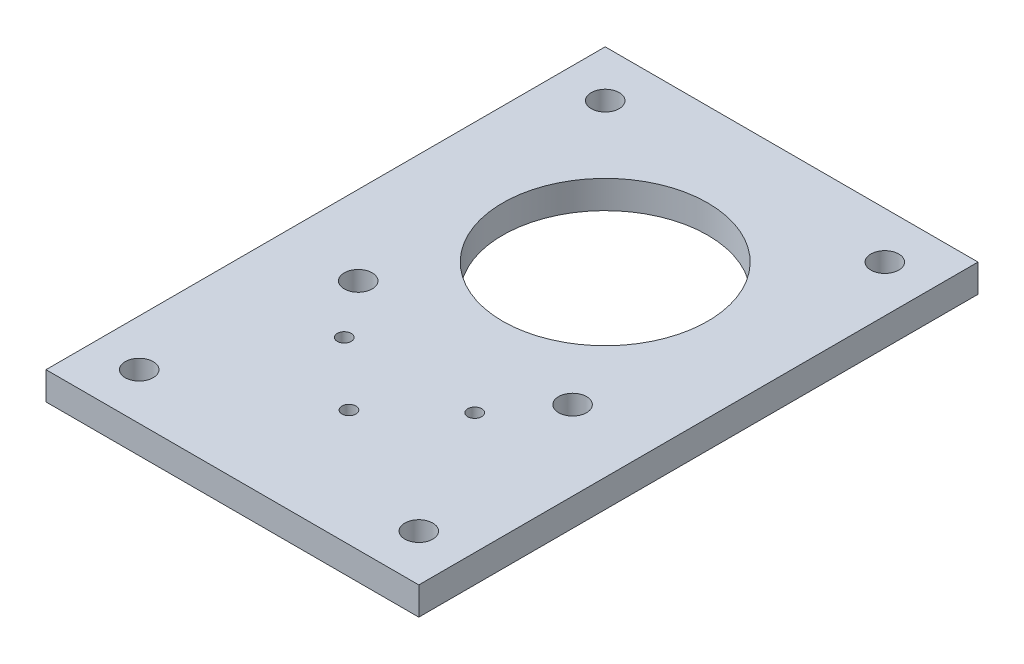
ISO-10303-21;
HEADER;
FILE_DESCRIPTION(('STEP AP214'),'2;1');
FILE_NAME('part.step','',(''),(''),'','','');
FILE_SCHEMA(('AUTOMOTIVE_DESIGN { 1 0 10303 214 1 1 1 1 }'));
ENDSEC;
DATA;
#1=APPLICATION_CONTEXT('core data for automotive mechanical design processes');
#2=APPLICATION_PROTOCOL_DEFINITION('international standard','automotive_design',2000,#1);
#3=PRODUCT_CONTEXT('',#1,'mechanical');
#4=PRODUCT('Part','Part','',(#3));
#5=PRODUCT_RELATED_PRODUCT_CATEGORY('part','',(#4));
#6=PRODUCT_DEFINITION_FORMATION('','',#4);
#7=PRODUCT_DEFINITION_CONTEXT('part definition',#1,'design');
#8=PRODUCT_DEFINITION('design','',#6,#7);
#9=PRODUCT_DEFINITION_SHAPE('','',#8);
#10=(LENGTH_UNIT() NAMED_UNIT(*) SI_UNIT(.MILLI.,.METRE.));
#11=(NAMED_UNIT(*) PLANE_ANGLE_UNIT() SI_UNIT($,.RADIAN.));
#12=(NAMED_UNIT(*) SI_UNIT($,.STERADIAN.) SOLID_ANGLE_UNIT());
#13=UNCERTAINTY_MEASURE_WITH_UNIT(LENGTH_MEASURE(1.E-05),#10,'distance_accuracy_value','');
#14=(GEOMETRIC_REPRESENTATION_CONTEXT(3) GLOBAL_UNCERTAINTY_ASSIGNED_CONTEXT((#13)) GLOBAL_UNIT_ASSIGNED_CONTEXT((#10,
#11,#12)) REPRESENTATION_CONTEXT('',''));
#15=CARTESIAN_POINT('',(0.,0.,0.));
#16=DIRECTION('',(0.,0.,1.));
#17=DIRECTION('',(1.,0.,0.));
#18=AXIS2_PLACEMENT_3D('',#15,#16,#17);
#19=CARTESIAN_POINT('',(0.,3.,0.));
#20=DIRECTION('',(0.,1.,0.));
#21=DIRECTION('',(0.,0.,1.));
#22=AXIS2_PLACEMENT_3D('',#19,#20,#21);
#23=PLANE('',#22);
#24=CARTESIAN_POINT('',(-11.5,3.,15.));
#25=DIRECTION('',(0.,1.,0.));
#26=DIRECTION('',(0.,0.,1.));
#27=AXIS2_PLACEMENT_3D('',#24,#25,#26);
#28=CIRCLE('',#27,1.5);
#29=CARTESIAN_POINT('',(-11.5,3.,16.5));
#30=VERTEX_POINT('',#29);
#31=EDGE_CURVE('E158',#30,#30,#28,.T.);
#32=ORIENTED_EDGE('',*,*,#31,.F.);
#33=EDGE_LOOP('',(#32));
#34=FACE_BOUND('',#33,.T.);
#35=CARTESIAN_POINT('',(-7.,3.,21.));
#36=DIRECTION('',(0.,1.,0.));
#37=DIRECTION('',(0.,0.,1.));
#38=AXIS2_PLACEMENT_3D('',#35,#36,#37);
#39=CIRCLE('',#38,0.750000000000001);
#40=CARTESIAN_POINT('',(-7.,3.,21.75));
#41=VERTEX_POINT('',#40);
#42=EDGE_CURVE('E146',#41,#41,#39,.T.);
#43=ORIENTED_EDGE('',*,*,#42,.F.);
#44=EDGE_LOOP('',(#43));
#45=FACE_BOUND('',#44,.T.);
#46=CARTESIAN_POINT('',(-15.,3.,35.));
#47=DIRECTION('',(0.,1.,0.));
#48=DIRECTION('',(0.,0.,1.));
#49=AXIS2_PLACEMENT_3D('',#46,#47,#48);
#50=CIRCLE('',#49,1.5);
#51=CARTESIAN_POINT('',(-15.,3.,36.5));
#52=VERTEX_POINT('',#51);
#53=EDGE_CURVE('E134',#52,#52,#50,.T.);
#54=ORIENTED_EDGE('',*,*,#53,.F.);
#55=EDGE_LOOP('',(#54));
#56=FACE_BOUND('',#55,.T.);
#57=CARTESIAN_POINT('',(15.,3.,-15.));
#58=DIRECTION('',(0.,1.,0.));
#59=DIRECTION('',(0.,0.,1.));
#60=AXIS2_PLACEMENT_3D('',#57,#58,#59);
#61=CIRCLE('',#60,1.5);
#62=CARTESIAN_POINT('',(15.,3.,-13.5));
#63=VERTEX_POINT('',#62);
#64=EDGE_CURVE('E122',#63,#63,#61,.T.);
#65=ORIENTED_EDGE('',*,*,#64,.F.);
#66=EDGE_LOOP('',(#65));
#67=FACE_BOUND('',#66,.T.);
#68=CARTESIAN_POINT('',(0.,3.,0.));
#69=DIRECTION('',(0.,1.,0.));
#70=DIRECTION('',(0.,0.,1.));
#71=AXIS2_PLACEMENT_3D('',#68,#69,#70);
#72=CIRCLE('',#71,11.);
#73=CARTESIAN_POINT('',(0.,3.,11.));
#74=VERTEX_POINT('',#73);
#75=EDGE_CURVE('E101',#74,#74,#72,.T.);
#76=ORIENTED_EDGE('',*,*,#75,.F.);
#77=EDGE_LOOP('',(#76));
#78=FACE_BOUND('',#77,.T.);
#79=DIRECTION('',(0.,0.,1.));
#80=VECTOR('',#79,1.);
#81=CARTESIAN_POINT('',(-20.,3.,-20.));
#82=LINE('',#81,#80);
#83=CARTESIAN_POINT('',(-20.,3.,-20.));
#84=VERTEX_POINT('',#83);
#85=CARTESIAN_POINT('',(-20.,3.,40.));
#86=VERTEX_POINT('',#85);
#87=EDGE_CURVE('E86',#84,#86,#82,.T.);
#88=ORIENTED_EDGE('',*,*,#87,.T.);
#89=DIRECTION('',(1.,0.,0.));
#90=VECTOR('',#89,1.);
#91=CARTESIAN_POINT('',(-20.,3.,40.));
#92=LINE('',#91,#90);
#93=CARTESIAN_POINT('',(20.,3.,40.));
#94=VERTEX_POINT('',#93);
#95=EDGE_CURVE('E81',#86,#94,#92,.T.);
#96=ORIENTED_EDGE('',*,*,#95,.T.);
#97=DIRECTION('',(0.,0.,-1.));
#98=VECTOR('',#97,1.);
#99=CARTESIAN_POINT('',(20.,3.,-20.));
#100=LINE('',#99,#98);
#101=CARTESIAN_POINT('',(20.,3.,-20.));
#102=VERTEX_POINT('',#101);
#103=EDGE_CURVE('E84',#94,#102,#100,.T.);
#104=ORIENTED_EDGE('',*,*,#103,.T.);
#105=DIRECTION('',(-1.,0.,0.));
#106=VECTOR('',#105,1.);
#107=CARTESIAN_POINT('',(-20.,3.,-20.));
#108=LINE('',#107,#106);
#109=EDGE_CURVE('E51',#102,#84,#108,.T.);
#110=ORIENTED_EDGE('',*,*,#109,.T.);
#111=EDGE_LOOP('',(#88,#96,#104,#110));
#112=FACE_BOUND('',#111,.T.);
#113=CARTESIAN_POINT('',(-15.,3.,-15.));
#114=DIRECTION('',(0.,1.,0.));
#115=DIRECTION('',(0.,0.,1.));
#116=AXIS2_PLACEMENT_3D('',#113,#114,#115);
#117=CIRCLE('',#116,1.5);
#118=CARTESIAN_POINT('',(-15.,3.,-13.5));
#119=VERTEX_POINT('',#118);
#120=EDGE_CURVE('E116',#119,#119,#117,.T.);
#121=ORIENTED_EDGE('',*,*,#120,.F.);
#122=EDGE_LOOP('',(#121));
#123=FACE_BOUND('',#122,.T.);
#124=CARTESIAN_POINT('',(15.,3.,35.));
#125=DIRECTION('',(0.,1.,0.));
#126=DIRECTION('',(0.,0.,1.));
#127=AXIS2_PLACEMENT_3D('',#124,#125,#126);
#128=CIRCLE('',#127,1.5);
#129=CARTESIAN_POINT('',(15.,3.,36.5));
#130=VERTEX_POINT('',#129);
#131=EDGE_CURVE('E128',#130,#130,#128,.T.);
#132=ORIENTED_EDGE('',*,*,#131,.F.);
#133=EDGE_LOOP('',(#132));
#134=FACE_BOUND('',#133,.T.);
#135=CARTESIAN_POINT('',(0.,3.,27.5));
#136=DIRECTION('',(0.,1.,0.));
#137=DIRECTION('',(0.,0.,1.));
#138=AXIS2_PLACEMENT_3D('',#135,#136,#137);
#139=CIRCLE('',#138,0.750000000000001);
#140=CARTESIAN_POINT('',(0.,3.,28.25));
#141=VERTEX_POINT('',#140);
#142=EDGE_CURVE('E140',#141,#141,#139,.T.);
#143=ORIENTED_EDGE('',*,*,#142,.F.);
#144=EDGE_LOOP('',(#143));
#145=FACE_BOUND('',#144,.T.);
#146=CARTESIAN_POINT('',(7.,3.,21.));
#147=DIRECTION('',(0.,1.,0.));
#148=DIRECTION('',(0.,0.,1.));
#149=AXIS2_PLACEMENT_3D('',#146,#147,#148);
#150=CIRCLE('',#149,0.750000000000001);
#151=CARTESIAN_POINT('',(7.,3.,21.75));
#152=VERTEX_POINT('',#151);
#153=EDGE_CURVE('E152',#152,#152,#150,.T.);
#154=ORIENTED_EDGE('',*,*,#153,.F.);
#155=EDGE_LOOP('',(#154));
#156=FACE_BOUND('',#155,.T.);
#157=CARTESIAN_POINT('',(11.5,3.,15.));
#158=DIRECTION('',(0.,1.,0.));
#159=DIRECTION('',(0.,0.,1.));
#160=AXIS2_PLACEMENT_3D('',#157,#158,#159);
#161=CIRCLE('',#160,1.5);
#162=CARTESIAN_POINT('',(11.5,3.,16.5));
#163=VERTEX_POINT('',#162);
#164=EDGE_CURVE('E164',#163,#163,#161,.T.);
#165=ORIENTED_EDGE('',*,*,#164,.F.);
#166=EDGE_LOOP('',(#165));
#167=FACE_BOUND('',#166,.T.);
#168=ADVANCED_FACE('F34',(#34,#45,#56,#67,#78,#112,#123,#134,#145,#156,#167),#23,.T.);
#169=CARTESIAN_POINT('',(0.,0.,0.));
#170=DIRECTION('',(0.,1.,0.));
#171=DIRECTION('',(0.,0.,1.));
#172=AXIS2_PLACEMENT_3D('',#169,#170,#171);
#173=PLANE('',#172);
#174=CARTESIAN_POINT('',(-11.5,0.,15.));
#175=DIRECTION('',(0.,1.,0.));
#176=DIRECTION('',(0.,0.,1.));
#177=AXIS2_PLACEMENT_3D('',#174,#175,#176);
#178=CIRCLE('',#177,1.5);
#179=CARTESIAN_POINT('',(-11.5,0.,16.5));
#180=VERTEX_POINT('',#179);
#181=EDGE_CURVE('E161',#180,#180,#178,.T.);
#182=ORIENTED_EDGE('',*,*,#181,.T.);
#183=EDGE_LOOP('',(#182));
#184=FACE_BOUND('',#183,.T.);
#185=CARTESIAN_POINT('',(-7.,0.,21.));
#186=DIRECTION('',(0.,1.,0.));
#187=DIRECTION('',(0.,0.,1.));
#188=AXIS2_PLACEMENT_3D('',#185,#186,#187);
#189=CIRCLE('',#188,0.750000000000001);
#190=CARTESIAN_POINT('',(-7.,0.,21.75));
#191=VERTEX_POINT('',#190);
#192=EDGE_CURVE('E149',#191,#191,#189,.T.);
#193=ORIENTED_EDGE('',*,*,#192,.T.);
#194=EDGE_LOOP('',(#193));
#195=FACE_BOUND('',#194,.T.);
#196=CARTESIAN_POINT('',(-15.,0.,35.));
#197=DIRECTION('',(0.,1.,0.));
#198=DIRECTION('',(0.,0.,1.));
#199=AXIS2_PLACEMENT_3D('',#196,#197,#198);
#200=CIRCLE('',#199,1.5);
#201=CARTESIAN_POINT('',(-15.,0.,36.5));
#202=VERTEX_POINT('',#201);
#203=EDGE_CURVE('E137',#202,#202,#200,.T.);
#204=ORIENTED_EDGE('',*,*,#203,.T.);
#205=EDGE_LOOP('',(#204));
#206=FACE_BOUND('',#205,.T.);
#207=CARTESIAN_POINT('',(15.,0.,-15.));
#208=DIRECTION('',(0.,1.,0.));
#209=DIRECTION('',(0.,0.,1.));
#210=AXIS2_PLACEMENT_3D('',#207,#208,#209);
#211=CIRCLE('',#210,1.5);
#212=CARTESIAN_POINT('',(15.,0.,-13.5));
#213=VERTEX_POINT('',#212);
#214=EDGE_CURVE('E125',#213,#213,#211,.T.);
#215=ORIENTED_EDGE('',*,*,#214,.T.);
#216=EDGE_LOOP('',(#215));
#217=FACE_BOUND('',#216,.T.);
#218=CARTESIAN_POINT('',(0.,0.,0.));
#219=DIRECTION('',(0.,1.,0.));
#220=DIRECTION('',(0.,0.,1.));
#221=AXIS2_PLACEMENT_3D('',#218,#219,#220);
#222=CIRCLE('',#221,11.);
#223=CARTESIAN_POINT('',(0.,0.,11.));
#224=VERTEX_POINT('',#223);
#225=EDGE_CURVE('E113',#224,#224,#222,.T.);
#226=ORIENTED_EDGE('',*,*,#225,.T.);
#227=EDGE_LOOP('',(#226));
#228=FACE_BOUND('',#227,.T.);
#229=DIRECTION('',(0.,0.,1.));
#230=VECTOR('',#229,1.);
#231=CARTESIAN_POINT('',(-20.,0.,-20.));
#232=LINE('',#231,#230);
#233=CARTESIAN_POINT('',(-20.,0.,-20.));
#234=VERTEX_POINT('',#233);
#235=CARTESIAN_POINT('',(-20.,0.,40.));
#236=VERTEX_POINT('',#235);
#237=EDGE_CURVE('E98',#234,#236,#232,.T.);
#238=ORIENTED_EDGE('',*,*,#237,.F.);
#239=DIRECTION('',(-1.,0.,0.));
#240=VECTOR('',#239,1.);
#241=CARTESIAN_POINT('',(-20.,0.,-20.));
#242=LINE('',#241,#240);
#243=CARTESIAN_POINT('',(20.,0.,-20.));
#244=VERTEX_POINT('',#243);
#245=EDGE_CURVE('E74',#244,#234,#242,.T.);
#246=ORIENTED_EDGE('',*,*,#245,.F.);
#247=DIRECTION('',(0.,0.,-1.));
#248=VECTOR('',#247,1.);
#249=CARTESIAN_POINT('',(20.,0.,-20.));
#250=LINE('',#249,#248);
#251=CARTESIAN_POINT('',(20.,0.,40.));
#252=VERTEX_POINT('',#251);
#253=EDGE_CURVE('E68',#252,#244,#250,.T.);
#254=ORIENTED_EDGE('',*,*,#253,.F.);
#255=DIRECTION('',(1.,0.,0.));
#256=VECTOR('',#255,1.);
#257=CARTESIAN_POINT('',(-20.,0.,40.));
#258=LINE('',#257,#256);
#259=EDGE_CURVE('E90',#236,#252,#258,.T.);
#260=ORIENTED_EDGE('',*,*,#259,.F.);
#261=EDGE_LOOP('',(#238,#246,#254,#260));
#262=FACE_BOUND('',#261,.T.);
#263=CARTESIAN_POINT('',(-15.,0.,-15.));
#264=DIRECTION('',(0.,1.,0.));
#265=DIRECTION('',(0.,0.,1.));
#266=AXIS2_PLACEMENT_3D('',#263,#264,#265);
#267=CIRCLE('',#266,1.5);
#268=CARTESIAN_POINT('',(-15.,0.,-13.5));
#269=VERTEX_POINT('',#268);
#270=EDGE_CURVE('E119',#269,#269,#267,.T.);
#271=ORIENTED_EDGE('',*,*,#270,.T.);
#272=EDGE_LOOP('',(#271));
#273=FACE_BOUND('',#272,.T.);
#274=CARTESIAN_POINT('',(15.,0.,35.));
#275=DIRECTION('',(0.,1.,0.));
#276=DIRECTION('',(0.,0.,1.));
#277=AXIS2_PLACEMENT_3D('',#274,#275,#276);
#278=CIRCLE('',#277,1.5);
#279=CARTESIAN_POINT('',(15.,0.,36.5));
#280=VERTEX_POINT('',#279);
#281=EDGE_CURVE('E131',#280,#280,#278,.T.);
#282=ORIENTED_EDGE('',*,*,#281,.T.);
#283=EDGE_LOOP('',(#282));
#284=FACE_BOUND('',#283,.T.);
#285=CARTESIAN_POINT('',(0.,0.,27.5));
#286=DIRECTION('',(0.,1.,0.));
#287=DIRECTION('',(0.,0.,1.));
#288=AXIS2_PLACEMENT_3D('',#285,#286,#287);
#289=CIRCLE('',#288,0.750000000000001);
#290=CARTESIAN_POINT('',(0.,0.,28.25));
#291=VERTEX_POINT('',#290);
#292=EDGE_CURVE('E143',#291,#291,#289,.T.);
#293=ORIENTED_EDGE('',*,*,#292,.T.);
#294=EDGE_LOOP('',(#293));
#295=FACE_BOUND('',#294,.T.);
#296=CARTESIAN_POINT('',(7.,0.,21.));
#297=DIRECTION('',(0.,1.,0.));
#298=DIRECTION('',(0.,0.,1.));
#299=AXIS2_PLACEMENT_3D('',#296,#297,#298);
#300=CIRCLE('',#299,0.750000000000001);
#301=CARTESIAN_POINT('',(7.,0.,21.75));
#302=VERTEX_POINT('',#301);
#303=EDGE_CURVE('E155',#302,#302,#300,.T.);
#304=ORIENTED_EDGE('',*,*,#303,.T.);
#305=EDGE_LOOP('',(#304));
#306=FACE_BOUND('',#305,.T.);
#307=CARTESIAN_POINT('',(11.5,0.,15.));
#308=DIRECTION('',(0.,1.,0.));
#309=DIRECTION('',(0.,0.,1.));
#310=AXIS2_PLACEMENT_3D('',#307,#308,#309);
#311=CIRCLE('',#310,1.5);
#312=CARTESIAN_POINT('',(11.5,0.,16.5));
#313=VERTEX_POINT('',#312);
#314=EDGE_CURVE('E167',#313,#313,#311,.T.);
#315=ORIENTED_EDGE('',*,*,#314,.T.);
#316=EDGE_LOOP('',(#315));
#317=FACE_BOUND('',#316,.T.);
#318=ADVANCED_FACE('F109',(#184,#195,#206,#217,#228,#262,#273,#284,#295,#306,#317),#173,.F.);
#319=CARTESIAN_POINT('',(-20.,3.,-20.));
#320=DIRECTION('',(1.,0.,0.));
#321=DIRECTION('',(0.,0.,-1.));
#322=AXIS2_PLACEMENT_3D('',#319,#320,#321);
#323=PLANE('',#322);
#324=ORIENTED_EDGE('',*,*,#237,.T.);
#325=DIRECTION('',(0.,-1.,0.));
#326=VECTOR('',#325,1.);
#327=CARTESIAN_POINT('',(-20.,3.,40.));
#328=LINE('',#327,#326);
#329=EDGE_CURVE('E11',#86,#236,#328,.T.);
#330=ORIENTED_EDGE('',*,*,#329,.F.);
#331=ORIENTED_EDGE('',*,*,#87,.F.);
#332=DIRECTION('',(0.,-1.,0.));
#333=VECTOR('',#332,1.);
#334=CARTESIAN_POINT('',(-20.,3.,-20.));
#335=LINE('',#334,#333);
#336=EDGE_CURVE('E94',#84,#234,#335,.T.);
#337=ORIENTED_EDGE('',*,*,#336,.T.);
#338=EDGE_LOOP('',(#324,#330,#331,#337));
#339=FACE_BOUND('',#338,.T.);
#340=ADVANCED_FACE('F36',(#339),#323,.F.);
#341=CARTESIAN_POINT('',(-20.,3.,40.));
#342=DIRECTION('',(0.,0.,-1.));
#343=DIRECTION('',(-1.,0.,0.));
#344=AXIS2_PLACEMENT_3D('',#341,#342,#343);
#345=PLANE('',#344);
#346=ORIENTED_EDGE('',*,*,#259,.T.);
#347=DIRECTION('',(0.,-1.,0.));
#348=VECTOR('',#347,1.);
#349=CARTESIAN_POINT('',(20.,3.,40.));
#350=LINE('',#349,#348);
#351=EDGE_CURVE('E43',#94,#252,#350,.T.);
#352=ORIENTED_EDGE('',*,*,#351,.F.);
#353=ORIENTED_EDGE('',*,*,#95,.F.);
#354=ORIENTED_EDGE('',*,*,#329,.T.);
#355=EDGE_LOOP('',(#346,#352,#353,#354));
#356=FACE_BOUND('',#355,.T.);
#357=ADVANCED_FACE('F89',(#356),#345,.F.);
#358=CARTESIAN_POINT('',(20.,3.,-20.));
#359=DIRECTION('',(-1.,0.,0.));
#360=DIRECTION('',(0.,0.,1.));
#361=AXIS2_PLACEMENT_3D('',#358,#359,#360);
#362=PLANE('',#361);
#363=ORIENTED_EDGE('',*,*,#253,.T.);
#364=DIRECTION('',(0.,-1.,0.));
#365=VECTOR('',#364,1.);
#366=CARTESIAN_POINT('',(20.,3.,-20.));
#367=LINE('',#366,#365);
#368=EDGE_CURVE('E91',#102,#244,#367,.T.);
#369=ORIENTED_EDGE('',*,*,#368,.F.);
#370=ORIENTED_EDGE('',*,*,#103,.F.);
#371=ORIENTED_EDGE('',*,*,#351,.T.);
#372=EDGE_LOOP('',(#363,#369,#370,#371));
#373=FACE_BOUND('',#372,.T.);
#374=ADVANCED_FACE('F92',(#373),#362,.F.);
#375=CARTESIAN_POINT('',(-20.,3.,-20.));
#376=DIRECTION('',(0.,0.,1.));
#377=DIRECTION('',(1.,0.,0.));
#378=AXIS2_PLACEMENT_3D('',#375,#376,#377);
#379=PLANE('',#378);
#380=ORIENTED_EDGE('',*,*,#245,.T.);
#381=ORIENTED_EDGE('',*,*,#336,.F.);
#382=ORIENTED_EDGE('',*,*,#109,.F.);
#383=ORIENTED_EDGE('',*,*,#368,.T.);
#384=EDGE_LOOP('',(#380,#381,#382,#383));
#385=FACE_BOUND('',#384,.T.);
#386=ADVANCED_FACE('F106',(#385),#379,.F.);
#387=CARTESIAN_POINT('',(0.,3.,0.));
#388=DIRECTION('',(0.,-1.,0.));
#389=DIRECTION('',(0.,0.,-1.));
#390=AXIS2_PLACEMENT_3D('',#387,#388,#389);
#391=CYLINDRICAL_SURFACE('',#390,11.);
#392=ORIENTED_EDGE('',*,*,#75,.T.);
#393=EDGE_LOOP('',(#392));
#394=FACE_BOUND('',#393,.T.);
#395=ORIENTED_EDGE('',*,*,#225,.F.);
#396=EDGE_LOOP('',(#395));
#397=FACE_BOUND('',#396,.T.);
#398=ADVANCED_FACE('F187',(#394,#397),#391,.F.);
#399=CARTESIAN_POINT('',(-15.,3.,-15.));
#400=DIRECTION('',(0.,-1.,0.));
#401=DIRECTION('',(0.,0.,-1.));
#402=AXIS2_PLACEMENT_3D('',#399,#400,#401);
#403=CYLINDRICAL_SURFACE('',#402,1.5);
#404=ORIENTED_EDGE('',*,*,#120,.T.);
#405=EDGE_LOOP('',(#404));
#406=FACE_BOUND('',#405,.T.);
#407=ORIENTED_EDGE('',*,*,#270,.F.);
#408=EDGE_LOOP('',(#407));
#409=FACE_BOUND('',#408,.T.);
#410=ADVANCED_FACE('F233',(#406,#409),#403,.F.);
#411=CARTESIAN_POINT('',(15.,3.,-15.));
#412=DIRECTION('',(0.,-1.,0.));
#413=DIRECTION('',(0.,0.,-1.));
#414=AXIS2_PLACEMENT_3D('',#411,#412,#413);
#415=CYLINDRICAL_SURFACE('',#414,1.5);
#416=ORIENTED_EDGE('',*,*,#64,.T.);
#417=EDGE_LOOP('',(#416));
#418=FACE_BOUND('',#417,.T.);
#419=ORIENTED_EDGE('',*,*,#214,.F.);
#420=EDGE_LOOP('',(#419));
#421=FACE_BOUND('',#420,.T.);
#422=ADVANCED_FACE('F241',(#418,#421),#415,.F.);
#423=CARTESIAN_POINT('',(15.,3.,35.));
#424=DIRECTION('',(0.,-1.,0.));
#425=DIRECTION('',(0.,0.,-1.));
#426=AXIS2_PLACEMENT_3D('',#423,#424,#425);
#427=CYLINDRICAL_SURFACE('',#426,1.5);
#428=ORIENTED_EDGE('',*,*,#131,.T.);
#429=EDGE_LOOP('',(#428));
#430=FACE_BOUND('',#429,.T.);
#431=ORIENTED_EDGE('',*,*,#281,.F.);
#432=EDGE_LOOP('',(#431));
#433=FACE_BOUND('',#432,.T.);
#434=ADVANCED_FACE('F249',(#430,#433),#427,.F.);
#435=CARTESIAN_POINT('',(-15.,3.,35.));
#436=DIRECTION('',(0.,-1.,0.));
#437=DIRECTION('',(0.,0.,-1.));
#438=AXIS2_PLACEMENT_3D('',#435,#436,#437);
#439=CYLINDRICAL_SURFACE('',#438,1.5);
#440=ORIENTED_EDGE('',*,*,#53,.T.);
#441=EDGE_LOOP('',(#440));
#442=FACE_BOUND('',#441,.T.);
#443=ORIENTED_EDGE('',*,*,#203,.F.);
#444=EDGE_LOOP('',(#443));
#445=FACE_BOUND('',#444,.T.);
#446=ADVANCED_FACE('F258',(#442,#445),#439,.F.);
#447=CARTESIAN_POINT('',(0.,3.,27.5));
#448=DIRECTION('',(0.,-1.,0.));
#449=DIRECTION('',(0.,0.,-1.));
#450=AXIS2_PLACEMENT_3D('',#447,#448,#449);
#451=CYLINDRICAL_SURFACE('',#450,0.750000000000001);
#452=ORIENTED_EDGE('',*,*,#142,.T.);
#453=EDGE_LOOP('',(#452));
#454=FACE_BOUND('',#453,.T.);
#455=ORIENTED_EDGE('',*,*,#292,.F.);
#456=EDGE_LOOP('',(#455));
#457=FACE_BOUND('',#456,.T.);
#458=ADVANCED_FACE('F267',(#454,#457),#451,.F.);
#459=CARTESIAN_POINT('',(-7.,3.,21.));
#460=DIRECTION('',(0.,-1.,0.));
#461=DIRECTION('',(0.,0.,-1.));
#462=AXIS2_PLACEMENT_3D('',#459,#460,#461);
#463=CYLINDRICAL_SURFACE('',#462,0.750000000000001);
#464=ORIENTED_EDGE('',*,*,#42,.T.);
#465=EDGE_LOOP('',(#464));
#466=FACE_BOUND('',#465,.T.);
#467=ORIENTED_EDGE('',*,*,#192,.F.);
#468=EDGE_LOOP('',(#467));
#469=FACE_BOUND('',#468,.T.);
#470=ADVANCED_FACE('F276',(#466,#469),#463,.F.);
#471=CARTESIAN_POINT('',(7.,3.,21.));
#472=DIRECTION('',(0.,-1.,0.));
#473=DIRECTION('',(0.,0.,-1.));
#474=AXIS2_PLACEMENT_3D('',#471,#472,#473);
#475=CYLINDRICAL_SURFACE('',#474,0.750000000000001);
#476=ORIENTED_EDGE('',*,*,#153,.T.);
#477=EDGE_LOOP('',(#476));
#478=FACE_BOUND('',#477,.T.);
#479=ORIENTED_EDGE('',*,*,#303,.F.);
#480=EDGE_LOOP('',(#479));
#481=FACE_BOUND('',#480,.T.);
#482=ADVANCED_FACE('F285',(#478,#481),#475,.F.);
#483=CARTESIAN_POINT('',(-11.5,3.,15.));
#484=DIRECTION('',(0.,-1.,0.));
#485=DIRECTION('',(0.,0.,-1.));
#486=AXIS2_PLACEMENT_3D('',#483,#484,#485);
#487=CYLINDRICAL_SURFACE('',#486,1.5);
#488=ORIENTED_EDGE('',*,*,#31,.T.);
#489=EDGE_LOOP('',(#488));
#490=FACE_BOUND('',#489,.T.);
#491=ORIENTED_EDGE('',*,*,#181,.F.);
#492=EDGE_LOOP('',(#491));
#493=FACE_BOUND('',#492,.T.);
#494=ADVANCED_FACE('F294',(#490,#493),#487,.F.);
#495=CARTESIAN_POINT('',(11.5,3.,15.));
#496=DIRECTION('',(0.,-1.,0.));
#497=DIRECTION('',(0.,0.,-1.));
#498=AXIS2_PLACEMENT_3D('',#495,#496,#497);
#499=CYLINDRICAL_SURFACE('',#498,1.5);
#500=ORIENTED_EDGE('',*,*,#164,.T.);
#501=EDGE_LOOP('',(#500));
#502=FACE_BOUND('',#501,.T.);
#503=ORIENTED_EDGE('',*,*,#314,.F.);
#504=EDGE_LOOP('',(#503));
#505=FACE_BOUND('',#504,.T.);
#506=ADVANCED_FACE('F173',(#502,#505),#499,.F.);
#507=CLOSED_SHELL('',(#168,#318,#340,#357,#374,#386,#398,#410,#422,#434,#446,#458,#470,#482,
#494,#506));
#508=MANIFOLD_SOLID_BREP('B2',#507);
#509=ADVANCED_BREP_SHAPE_REPRESENTATION('',(#18,#508),#14);
#510=SHAPE_DEFINITION_REPRESENTATION(#9,#509);
ENDSEC;
END-ISO-10303-21;
